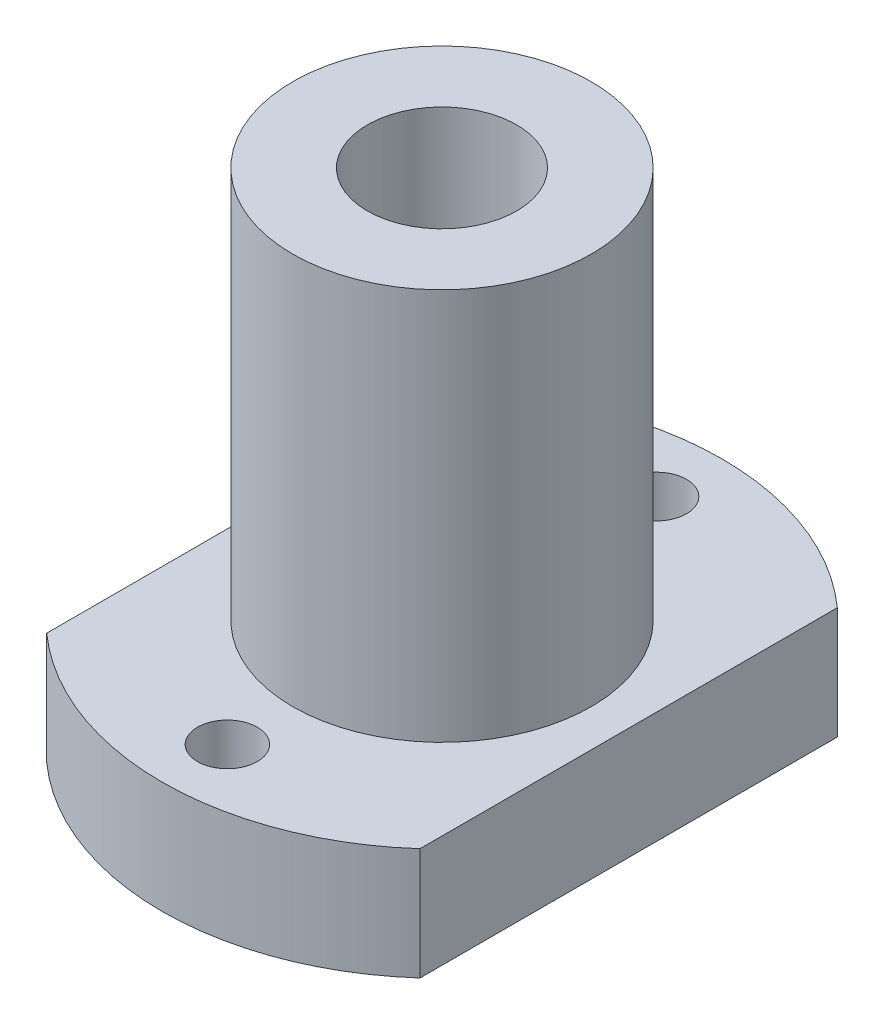
ISO-10303-21;
HEADER;
FILE_DESCRIPTION(('STEP AP214'),'2;1');
FILE_NAME('part.step','',(''),(''),'','','');
FILE_SCHEMA(('AUTOMOTIVE_DESIGN { 1 0 10303 214 1 1 1 1 }'));
ENDSEC;
DATA;
#1=APPLICATION_CONTEXT('core data for automotive mechanical design processes');
#2=APPLICATION_PROTOCOL_DEFINITION('international standard','automotive_design',2000,#1);
#3=PRODUCT_CONTEXT('',#1,'mechanical');
#4=PRODUCT('Part','Part','',(#3));
#5=PRODUCT_RELATED_PRODUCT_CATEGORY('part','',(#4));
#6=PRODUCT_DEFINITION_FORMATION('','',#4);
#7=PRODUCT_DEFINITION_CONTEXT('part definition',#1,'design');
#8=PRODUCT_DEFINITION('design','',#6,#7);
#9=PRODUCT_DEFINITION_SHAPE('','',#8);
#10=(LENGTH_UNIT() NAMED_UNIT(*) SI_UNIT(.MILLI.,.METRE.));
#11=(NAMED_UNIT(*) PLANE_ANGLE_UNIT() SI_UNIT($,.RADIAN.));
#12=(NAMED_UNIT(*) SI_UNIT($,.STERADIAN.) SOLID_ANGLE_UNIT());
#13=UNCERTAINTY_MEASURE_WITH_UNIT(LENGTH_MEASURE(1.E-05),#10,'distance_accuracy_value','');
#14=(GEOMETRIC_REPRESENTATION_CONTEXT(3) GLOBAL_UNCERTAINTY_ASSIGNED_CONTEXT((#13)) GLOBAL_UNIT_ASSIGNED_CONTEXT((#10,
#11,#12)) REPRESENTATION_CONTEXT('',''));
#15=CARTESIAN_POINT('',(0.,0.,0.));
#16=DIRECTION('',(0.,0.,1.));
#17=DIRECTION('',(1.,0.,0.));
#18=AXIS2_PLACEMENT_3D('',#15,#16,#17);
#19=CARTESIAN_POINT('',(0.,-3.,0.));
#20=DIRECTION('',(0.,1.,0.));
#21=DIRECTION('',(0.,0.,1.));
#22=AXIS2_PLACEMENT_3D('',#19,#20,#21);
#23=PLANE('',#22);
#24=DIRECTION('',(0.,0.,1.));
#25=VECTOR('',#24,1.);
#26=CARTESIAN_POINT('',(-10.,-3.,-11.1803398875));
#27=LINE('',#26,#25);
#28=CARTESIAN_POINT('',(-10.,-3.,-11.1803398874991));
#29=VERTEX_POINT('',#28);
#30=CARTESIAN_POINT('',(-9.99999999999987,-3.,11.1803398874991));
#31=VERTEX_POINT('',#30);
#32=EDGE_CURVE('E68',#29,#31,#27,.T.);
#33=ORIENTED_EDGE('',*,*,#32,.F.);
#34=CARTESIAN_POINT('',(0.,-3.,0.));
#35=DIRECTION('',(0.,1.,0.));
#36=DIRECTION('',(0.,0.,1.));
#37=AXIS2_PLACEMENT_3D('',#34,#35,#36);
#38=CIRCLE('',#37,15.);
#39=CARTESIAN_POINT('',(9.99999999999987,-3.,-11.1803398874991));
#40=VERTEX_POINT('',#39);
#41=EDGE_CURVE('E58',#40,#29,#38,.T.);
#42=ORIENTED_EDGE('',*,*,#41,.F.);
#43=DIRECTION('',(0.,0.,-1.));
#44=VECTOR('',#43,1.);
#45=CARTESIAN_POINT('',(10.,-3.,11.1803398875));
#46=LINE('',#45,#44);
#47=CARTESIAN_POINT('',(9.99999999999987,-3.,11.1803398874991));
#48=VERTEX_POINT('',#47);
#49=EDGE_CURVE('E53',#48,#40,#46,.T.);
#50=ORIENTED_EDGE('',*,*,#49,.F.);
#51=CARTESIAN_POINT('',(0.,-3.,0.));
#52=DIRECTION('',(0.,1.,0.));
#53=DIRECTION('',(0.,0.,1.));
#54=AXIS2_PLACEMENT_3D('',#51,#52,#53);
#55=CIRCLE('',#54,15.);
#56=EDGE_CURVE('E71',#31,#48,#55,.T.);
#57=ORIENTED_EDGE('',*,*,#56,.F.);
#58=EDGE_LOOP('',(#33,#42,#50,#57));
#59=FACE_BOUND('',#58,.T.);
#60=CARTESIAN_POINT('',(0.,-3.,11.5));
#61=DIRECTION('',(0.,1.,0.));
#62=DIRECTION('',(0.,0.,1.));
#63=AXIS2_PLACEMENT_3D('',#60,#61,#62);
#64=CIRCLE('',#63,1.6);
#65=CARTESIAN_POINT('',(0.,-3.,13.1));
#66=VERTEX_POINT('',#65);
#67=EDGE_CURVE('E82',#66,#66,#64,.T.);
#68=ORIENTED_EDGE('',*,*,#67,.T.);
#69=EDGE_LOOP('',(#68));
#70=FACE_BOUND('',#69,.T.);
#71=CARTESIAN_POINT('',(0.,-3.,-11.5));
#72=DIRECTION('',(0.,1.,0.));
#73=DIRECTION('',(0.,0.,1.));
#74=AXIS2_PLACEMENT_3D('',#71,#72,#73);
#75=CIRCLE('',#74,1.6);
#76=CARTESIAN_POINT('',(0.,-3.,-9.9));
#77=VERTEX_POINT('',#76);
#78=EDGE_CURVE('E104',#77,#77,#75,.T.);
#79=ORIENTED_EDGE('',*,*,#78,.T.);
#80=EDGE_LOOP('',(#79));
#81=FACE_BOUND('',#80,.T.);
#82=CARTESIAN_POINT('',(0.,-3.,0.));
#83=DIRECTION('',(0.,1.,0.));
#84=DIRECTION('',(0.,0.,1.));
#85=AXIS2_PLACEMENT_3D('',#82,#83,#84);
#86=CIRCLE('',#85,4.);
#87=CARTESIAN_POINT('',(0.,-3.,4.));
#88=VERTEX_POINT('',#87);
#89=EDGE_CURVE('E19',#88,#88,#86,.T.);
#90=ORIENTED_EDGE('',*,*,#89,.T.);
#91=EDGE_LOOP('',(#90));
#92=FACE_BOUND('',#91,.T.);
#93=ADVANCED_FACE('F16',(#59,#70,#81,#92),#23,.F.);
#94=CARTESIAN_POINT('',(0.,3.,0.));
#95=DIRECTION('',(0.,1.,0.));
#96=DIRECTION('',(0.,0.,1.));
#97=AXIS2_PLACEMENT_3D('',#94,#95,#96);
#98=CYLINDRICAL_SURFACE('',#97,4.);
#99=CARTESIAN_POINT('',(0.,24.,0.));
#100=DIRECTION('',(0.,1.,0.));
#101=DIRECTION('',(0.,0.,1.));
#102=AXIS2_PLACEMENT_3D('',#99,#100,#101);
#103=CIRCLE('',#102,4.);
#104=CARTESIAN_POINT('',(0.,24.,4.));
#105=VERTEX_POINT('',#104);
#106=EDGE_CURVE('E98',#105,#105,#103,.F.);
#107=ORIENTED_EDGE('',*,*,#106,.F.);
#108=EDGE_LOOP('',(#107));
#109=FACE_BOUND('',#108,.T.);
#110=ORIENTED_EDGE('',*,*,#89,.F.);
#111=EDGE_LOOP('',(#110));
#112=FACE_BOUND('',#111,.T.);
#113=ADVANCED_FACE('F112',(#109,#112),#98,.F.);
#114=CARTESIAN_POINT('',(0.,-3.,-11.5));
#115=DIRECTION('',(0.,1.,0.));
#116=DIRECTION('',(0.,0.,1.));
#117=AXIS2_PLACEMENT_3D('',#114,#115,#116);
#118=CYLINDRICAL_SURFACE('',#117,1.6);
#119=ORIENTED_EDGE('',*,*,#78,.F.);
#120=EDGE_LOOP('',(#119));
#121=FACE_BOUND('',#120,.T.);
#122=CARTESIAN_POINT('',(0.,3.,-11.5));
#123=DIRECTION('',(0.,1.,0.));
#124=DIRECTION('',(0.,0.,1.));
#125=AXIS2_PLACEMENT_3D('',#122,#123,#124);
#126=CIRCLE('',#125,1.6);
#127=CARTESIAN_POINT('',(0.,3.,-9.9));
#128=VERTEX_POINT('',#127);
#129=EDGE_CURVE('E95',#128,#128,#126,.F.);
#130=ORIENTED_EDGE('',*,*,#129,.F.);
#131=EDGE_LOOP('',(#130));
#132=FACE_BOUND('',#131,.T.);
#133=ADVANCED_FACE('F114',(#121,#132),#118,.F.);
#134=CARTESIAN_POINT('',(0.,-3.,11.5));
#135=DIRECTION('',(0.,1.,0.));
#136=DIRECTION('',(0.,0.,1.));
#137=AXIS2_PLACEMENT_3D('',#134,#135,#136);
#138=CYLINDRICAL_SURFACE('',#137,1.6);
#139=ORIENTED_EDGE('',*,*,#67,.F.);
#140=EDGE_LOOP('',(#139));
#141=FACE_BOUND('',#140,.T.);
#142=CARTESIAN_POINT('',(0.,3.,11.5));
#143=DIRECTION('',(0.,1.,0.));
#144=DIRECTION('',(0.,0.,1.));
#145=AXIS2_PLACEMENT_3D('',#142,#143,#144);
#146=CIRCLE('',#145,1.6);
#147=CARTESIAN_POINT('',(0.,3.,13.1));
#148=VERTEX_POINT('',#147);
#149=EDGE_CURVE('E92',#148,#148,#146,.F.);
#150=ORIENTED_EDGE('',*,*,#149,.F.);
#151=EDGE_LOOP('',(#150));
#152=FACE_BOUND('',#151,.T.);
#153=ADVANCED_FACE('F121',(#141,#152),#138,.F.);
#154=CARTESIAN_POINT('',(10.,-3.,11.1803398875));
#155=DIRECTION('',(1.,0.,0.));
#156=DIRECTION('',(0.,0.,-1.));
#157=AXIS2_PLACEMENT_3D('',#154,#155,#156);
#158=PLANE('',#157);
#159=DIRECTION('',(0.,1.,0.));
#160=VECTOR('',#159,1.);
#161=CARTESIAN_POINT('',(9.99999999999974,-3.,-11.1803398874992));
#162=LINE('',#161,#160);
#163=CARTESIAN_POINT('',(9.99999999999987,3.,-11.1803398874991));
#164=VERTEX_POINT('',#163);
#165=EDGE_CURVE('E64',#164,#40,#162,.F.);
#166=ORIENTED_EDGE('',*,*,#165,.F.);
#167=DIRECTION('',(0.,0.,1.));
#168=VECTOR('',#167,1.);
#169=CARTESIAN_POINT('',(10.,3.,0.));
#170=LINE('',#169,#168);
#171=CARTESIAN_POINT('',(9.99999999999987,3.,11.1803398874991));
#172=VERTEX_POINT('',#171);
#173=EDGE_CURVE('E91',#172,#164,#170,.F.);
#174=ORIENTED_EDGE('',*,*,#173,.F.);
#175=DIRECTION('',(0.,1.,0.));
#176=VECTOR('',#175,1.);
#177=CARTESIAN_POINT('',(9.99999999999974,-3.,11.1803398874992));
#178=LINE('',#177,#176);
#179=EDGE_CURVE('E101',#48,#172,#178,.T.);
#180=ORIENTED_EDGE('',*,*,#179,.F.);
#181=ORIENTED_EDGE('',*,*,#49,.T.);
#182=EDGE_LOOP('',(#166,#174,#180,#181));
#183=FACE_BOUND('',#182,.T.);
#184=ADVANCED_FACE('F149',(#183),#158,.T.);
#185=CARTESIAN_POINT('',(0.,-3.,0.));
#186=DIRECTION('',(0.,1.,0.));
#187=DIRECTION('',(0.,0.,1.));
#188=AXIS2_PLACEMENT_3D('',#185,#186,#187);
#189=CYLINDRICAL_SURFACE('',#188,15.);
#190=DIRECTION('',(0.,1.,0.));
#191=VECTOR('',#190,1.);
#192=CARTESIAN_POINT('',(-10.,-3.,-11.1803398874992));
#193=LINE('',#192,#191);
#194=CARTESIAN_POINT('',(-9.99999999999987,3.,-11.1803398874992));
#195=VERTEX_POINT('',#194);
#196=EDGE_CURVE('E63',#195,#29,#193,.F.);
#197=ORIENTED_EDGE('',*,*,#196,.F.);
#198=CARTESIAN_POINT('',(0.,3.,0.));
#199=DIRECTION('',(0.,1.,0.));
#200=DIRECTION('',(0.,0.,1.));
#201=AXIS2_PLACEMENT_3D('',#198,#199,#200);
#202=CIRCLE('',#201,15.);
#203=EDGE_CURVE('E89',#164,#195,#202,.T.);
#204=ORIENTED_EDGE('',*,*,#203,.F.);
#205=ORIENTED_EDGE('',*,*,#165,.T.);
#206=ORIENTED_EDGE('',*,*,#41,.T.);
#207=EDGE_LOOP('',(#197,#204,#205,#206));
#208=FACE_BOUND('',#207,.T.);
#209=ADVANCED_FACE('F60',(#208),#189,.T.);
#210=CARTESIAN_POINT('',(-10.,-3.,-11.1803398875));
#211=DIRECTION('',(-1.,0.,0.));
#212=DIRECTION('',(0.,0.,1.));
#213=AXIS2_PLACEMENT_3D('',#210,#211,#212);
#214=PLANE('',#213);
#215=DIRECTION('',(0.,1.,0.));
#216=VECTOR('',#215,1.);
#217=CARTESIAN_POINT('',(-9.99999999999974,-3.,11.1803398874992));
#218=LINE('',#217,#216);
#219=CARTESIAN_POINT('',(-9.99999999999974,3.,11.1803398874992));
#220=VERTEX_POINT('',#219);
#221=EDGE_CURVE('E34',#220,#31,#218,.F.);
#222=ORIENTED_EDGE('',*,*,#221,.F.);
#223=DIRECTION('',(0.,0.,1.));
#224=VECTOR('',#223,1.);
#225=CARTESIAN_POINT('',(-9.99999999999974,3.,0.));
#226=LINE('',#225,#224);
#227=EDGE_CURVE('E75',#195,#220,#226,.T.);
#228=ORIENTED_EDGE('',*,*,#227,.F.);
#229=ORIENTED_EDGE('',*,*,#196,.T.);
#230=ORIENTED_EDGE('',*,*,#32,.T.);
#231=EDGE_LOOP('',(#222,#228,#229,#230));
#232=FACE_BOUND('',#231,.T.);
#233=ADVANCED_FACE('F73',(#232),#214,.T.);
#234=CARTESIAN_POINT('',(0.,-3.,0.));
#235=DIRECTION('',(0.,1.,0.));
#236=DIRECTION('',(0.,0.,1.));
#237=AXIS2_PLACEMENT_3D('',#234,#235,#236);
#238=CYLINDRICAL_SURFACE('',#237,15.);
#239=ORIENTED_EDGE('',*,*,#179,.T.);
#240=CARTESIAN_POINT('',(0.,3.,0.));
#241=DIRECTION('',(0.,1.,0.));
#242=DIRECTION('',(0.,0.,1.));
#243=AXIS2_PLACEMENT_3D('',#240,#241,#242);
#244=CIRCLE('',#243,15.);
#245=EDGE_CURVE('E86',#220,#172,#244,.T.);
#246=ORIENTED_EDGE('',*,*,#245,.F.);
#247=ORIENTED_EDGE('',*,*,#221,.T.);
#248=ORIENTED_EDGE('',*,*,#56,.T.);
#249=EDGE_LOOP('',(#239,#246,#247,#248));
#250=FACE_BOUND('',#249,.T.);
#251=ADVANCED_FACE('F140',(#250),#238,.T.);
#252=CARTESIAN_POINT('',(0.,24.,0.));
#253=DIRECTION('',(0.,1.,0.));
#254=DIRECTION('',(0.,0.,1.));
#255=AXIS2_PLACEMENT_3D('',#252,#253,#254);
#256=PLANE('',#255);
#257=CARTESIAN_POINT('',(0.,24.,0.));
#258=DIRECTION('',(0.,1.,0.));
#259=DIRECTION('',(0.,0.,1.));
#260=AXIS2_PLACEMENT_3D('',#257,#258,#259);
#261=CIRCLE('',#260,8.);
#262=CARTESIAN_POINT('',(0.,24.,8.));
#263=VERTEX_POINT('',#262);
#264=EDGE_CURVE('E25',#263,#263,#261,.F.);
#265=ORIENTED_EDGE('',*,*,#264,.F.);
#266=EDGE_LOOP('',(#265));
#267=FACE_BOUND('',#266,.T.);
#268=ORIENTED_EDGE('',*,*,#106,.T.);
#269=EDGE_LOOP('',(#268));
#270=FACE_BOUND('',#269,.T.);
#271=ADVANCED_FACE('F133',(#267,#270),#256,.T.);
#272=CARTESIAN_POINT('',(0.,3.,0.));
#273=DIRECTION('',(0.,1.,0.));
#274=DIRECTION('',(0.,0.,1.));
#275=AXIS2_PLACEMENT_3D('',#272,#273,#274);
#276=PLANE('',#275);
#277=ORIENTED_EDGE('',*,*,#227,.T.);
#278=ORIENTED_EDGE('',*,*,#245,.T.);
#279=ORIENTED_EDGE('',*,*,#173,.T.);
#280=ORIENTED_EDGE('',*,*,#203,.T.);
#281=EDGE_LOOP('',(#277,#278,#279,#280));
#282=FACE_BOUND('',#281,.T.);
#283=ORIENTED_EDGE('',*,*,#149,.T.);
#284=EDGE_LOOP('',(#283));
#285=FACE_BOUND('',#284,.T.);
#286=ORIENTED_EDGE('',*,*,#129,.T.);
#287=EDGE_LOOP('',(#286));
#288=FACE_BOUND('',#287,.T.);
#289=CARTESIAN_POINT('',(0.,3.,0.));
#290=DIRECTION('',(0.,1.,0.));
#291=DIRECTION('',(0.,0.,1.));
#292=AXIS2_PLACEMENT_3D('',#289,#290,#291);
#293=CIRCLE('',#292,8.);
#294=CARTESIAN_POINT('',(0.,3.,8.));
#295=VERTEX_POINT('',#294);
#296=EDGE_CURVE('E11',#295,#295,#293,.T.);
#297=ORIENTED_EDGE('',*,*,#296,.F.);
#298=EDGE_LOOP('',(#297));
#299=FACE_BOUND('',#298,.T.);
#300=ADVANCED_FACE('F127',(#282,#285,#288,#299),#276,.T.);
#301=CARTESIAN_POINT('',(0.,3.,0.));
#302=DIRECTION('',(0.,1.,0.));
#303=DIRECTION('',(0.,0.,1.));
#304=AXIS2_PLACEMENT_3D('',#301,#302,#303);
#305=CYLINDRICAL_SURFACE('',#304,8.);
#306=ORIENTED_EDGE('',*,*,#296,.T.);
#307=EDGE_LOOP('',(#306));
#308=FACE_BOUND('',#307,.T.);
#309=ORIENTED_EDGE('',*,*,#264,.T.);
#310=EDGE_LOOP('',(#309));
#311=FACE_BOUND('',#310,.T.);
#312=ADVANCED_FACE('F125',(#308,#311),#305,.T.);
#313=CLOSED_SHELL('',(#93,#113,#133,#153,#184,#209,#233,#251,#271,#300,#312));
#314=MANIFOLD_SOLID_BREP('B1',#313);
#315=ADVANCED_BREP_SHAPE_REPRESENTATION('',(#18,#314),#14);
#316=SHAPE_DEFINITION_REPRESENTATION(#9,#315);
ENDSEC;
END-ISO-10303-21;
